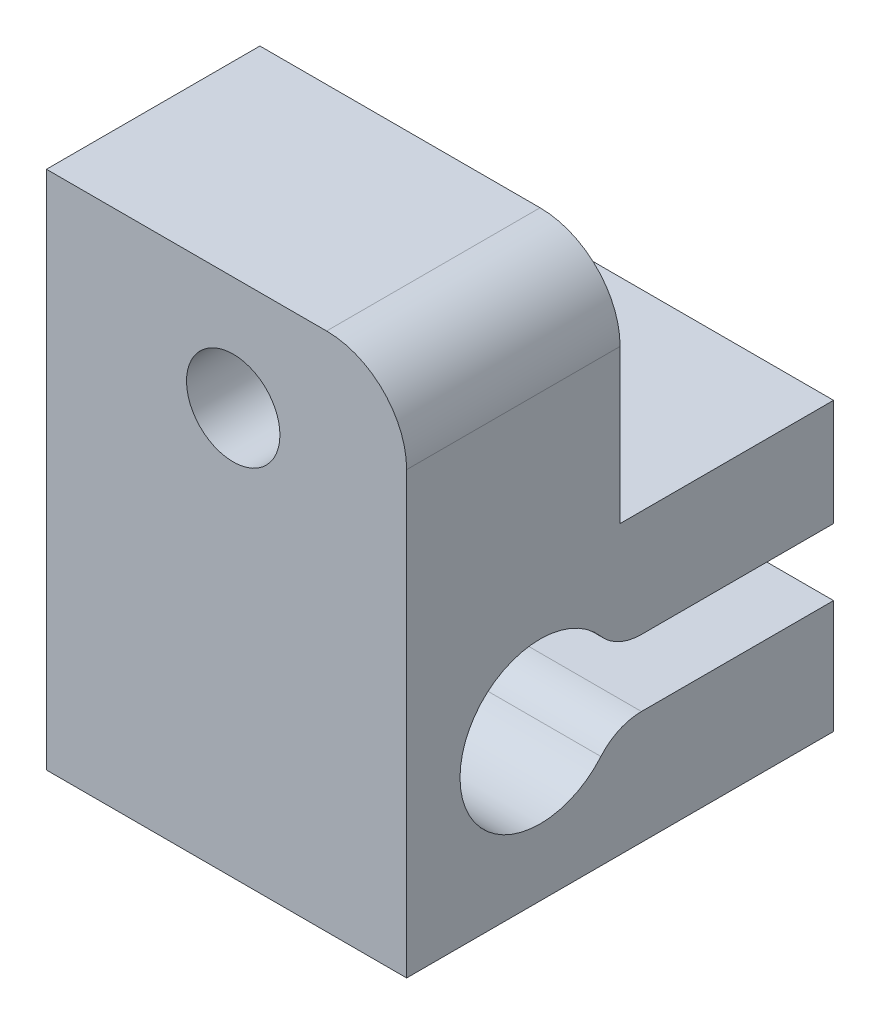
ISO-10303-21;
HEADER;
FILE_DESCRIPTION(('STEP AP214'),'2;1');
FILE_NAME('part.step','',(''),(''),'','','');
FILE_SCHEMA(('AUTOMOTIVE_DESIGN { 1 0 10303 214 1 1 1 1 }'));
ENDSEC;
DATA;
#1=APPLICATION_CONTEXT('core data for automotive mechanical design processes');
#2=APPLICATION_PROTOCOL_DEFINITION('international standard','automotive_design',2000,#1);
#3=PRODUCT_CONTEXT('',#1,'mechanical');
#4=PRODUCT('Part','Part','',(#3));
#5=PRODUCT_RELATED_PRODUCT_CATEGORY('part','',(#4));
#6=PRODUCT_DEFINITION_FORMATION('','',#4);
#7=PRODUCT_DEFINITION_CONTEXT('part definition',#1,'design');
#8=PRODUCT_DEFINITION('design','',#6,#7);
#9=PRODUCT_DEFINITION_SHAPE('','',#8);
#10=(LENGTH_UNIT() NAMED_UNIT(*) SI_UNIT(.MILLI.,.METRE.));
#11=(NAMED_UNIT(*) PLANE_ANGLE_UNIT() SI_UNIT($,.RADIAN.));
#12=(NAMED_UNIT(*) SI_UNIT($,.STERADIAN.) SOLID_ANGLE_UNIT());
#13=UNCERTAINTY_MEASURE_WITH_UNIT(LENGTH_MEASURE(1.E-05),#10,'distance_accuracy_value','');
#14=(GEOMETRIC_REPRESENTATION_CONTEXT(3) GLOBAL_UNCERTAINTY_ASSIGNED_CONTEXT((#13)) GLOBAL_UNIT_ASSIGNED_CONTEXT((#10,
#11,#12)) REPRESENTATION_CONTEXT('',''));
#15=CARTESIAN_POINT('',(0.,0.,0.));
#16=DIRECTION('',(0.,0.,1.));
#17=DIRECTION('',(1.,0.,0.));
#18=AXIS2_PLACEMENT_3D('',#15,#16,#17);
#19=CARTESIAN_POINT('',(7.,5.5,8.));
#20=DIRECTION('',(0.,0.,-1.));
#21=DIRECTION('',(0.,1.,0.));
#22=AXIS2_PLACEMENT_3D('',#19,#20,#21);
#23=CYLINDRICAL_SURFACE('',#22,1.75);
#24=CARTESIAN_POINT('',(7.,5.5,8.));
#25=DIRECTION('',(0.,0.,-1.));
#26=DIRECTION('',(0.,1.,0.));
#27=AXIS2_PLACEMENT_3D('',#24,#25,#26);
#28=CIRCLE('',#27,1.75);
#29=CARTESIAN_POINT('',(7.,7.25,8.));
#30=VERTEX_POINT('',#29);
#31=EDGE_CURVE('E653',#30,#30,#28,.T.);
#32=ORIENTED_EDGE('',*,*,#31,.F.);
#33=EDGE_LOOP('',(#32));
#34=FACE_BOUND('',#33,.T.);
#35=CARTESIAN_POINT('',(7.,5.5,5.));
#36=DIRECTION('',(0.,0.,-1.));
#37=DIRECTION('',(0.,1.,0.));
#38=AXIS2_PLACEMENT_3D('',#35,#36,#37);
#39=CIRCLE('',#38,1.75);
#40=CARTESIAN_POINT('',(7.,7.25,5.));
#41=VERTEX_POINT('',#40);
#42=EDGE_CURVE('E648',#41,#41,#39,.T.);
#43=ORIENTED_EDGE('',*,*,#42,.T.);
#44=EDGE_LOOP('',(#43));
#45=FACE_BOUND('',#44,.T.);
#46=ADVANCED_FACE('F55',(#34,#45),#23,.F.);
#47=CARTESIAN_POINT('',(0.,-4.25,3.));
#48=DIRECTION('',(1.,0.,0.));
#49=DIRECTION('',(0.,0.,-1.));
#50=AXIS2_PLACEMENT_3D('',#47,#48,#49);
#51=CYLINDRICAL_SURFACE('',#50,1.75);
#52=CARTESIAN_POINT('',(4.5,-4.25,3.));
#53=DIRECTION('',(1.,0.,0.));
#54=DIRECTION('',(0.,0.,-1.));
#55=AXIS2_PLACEMENT_3D('',#52,#53,#54);
#56=CIRCLE('',#55,1.75);
#57=CARTESIAN_POINT('',(4.5,-4.25,1.25));
#58=VERTEX_POINT('',#57);
#59=EDGE_CURVE('E255',#58,#58,#56,.T.);
#60=ORIENTED_EDGE('',*,*,#59,.T.);
#61=EDGE_LOOP('',(#60));
#62=FACE_BOUND('',#61,.T.);
#63=CARTESIAN_POINT('',(2.5,-4.25,3.));
#64=DIRECTION('',(-1.,0.,0.));
#65=DIRECTION('',(0.,0.,1.));
#66=AXIS2_PLACEMENT_3D('',#63,#64,#65);
#67=CIRCLE('',#66,1.75);
#68=CARTESIAN_POINT('',(2.5,-4.25,4.75));
#69=VERTEX_POINT('',#68);
#70=EDGE_CURVE('E222',#69,#69,#67,.T.);
#71=ORIENTED_EDGE('',*,*,#70,.T.);
#72=EDGE_LOOP('',(#71));
#73=FACE_BOUND('',#72,.T.);
#74=ADVANCED_FACE('F468',(#62,#73),#51,.F.);
#75=CARTESIAN_POINT('',(13.5,0.,0.));
#76=DIRECTION('',(0.,0.,-1.));
#77=DIRECTION('',(0.,1.,0.));
#78=AXIS2_PLACEMENT_3D('',#75,#76,#77);
#79=PLANE('',#78);
#80=CARTESIAN_POINT('',(7.,5.5,0.));
#81=DIRECTION('',(0.,0.,-1.));
#82=DIRECTION('',(0.,1.,0.));
#83=AXIS2_PLACEMENT_3D('',#80,#81,#82);
#84=CIRCLE('',#83,3.);
#85=CARTESIAN_POINT('',(7.,8.5,0.));
#86=VERTEX_POINT('',#85);
#87=EDGE_CURVE('E644',#86,#86,#84,.T.);
#88=ORIENTED_EDGE('',*,*,#87,.F.);
#89=EDGE_LOOP('',(#88));
#90=FACE_BOUND('',#89,.T.);
#91=DIRECTION('',(-1.,0.,0.));
#92=VECTOR('',#91,1.);
#93=CARTESIAN_POINT('',(13.5,9.75,0.));
#94=LINE('',#93,#92);
#95=CARTESIAN_POINT('',(10.5,9.75,0.));
#96=VERTEX_POINT('',#95);
#97=CARTESIAN_POINT('',(0.,9.75,0.));
#98=VERTEX_POINT('',#97);
#99=EDGE_CURVE('E357',#96,#98,#94,.T.);
#100=ORIENTED_EDGE('',*,*,#99,.F.);
#101=CARTESIAN_POINT('',(10.5,6.75,0.));
#102=DIRECTION('',(0.,0.,-1.));
#103=DIRECTION('',(0.,1.,0.));
#104=AXIS2_PLACEMENT_3D('',#101,#102,#103);
#105=CIRCLE('',#104,3.);
#106=CARTESIAN_POINT('',(13.5,6.75,0.));
#107=VERTEX_POINT('',#106);
#108=EDGE_CURVE('E367',#96,#107,#105,.T.);
#109=ORIENTED_EDGE('',*,*,#108,.T.);
#110=DIRECTION('',(0.,-1.,0.));
#111=VECTOR('',#110,1.);
#112=CARTESIAN_POINT('',(13.5,0.,0.));
#113=LINE('',#112,#111);
#114=CARTESIAN_POINT('',(13.5,0.999999999999998,0.));
#115=VERTEX_POINT('',#114);
#116=EDGE_CURVE('E300',#107,#115,#113,.T.);
#117=ORIENTED_EDGE('',*,*,#116,.T.);
#118=DIRECTION('',(-1.,0.,0.));
#119=VECTOR('',#118,1.);
#120=CARTESIAN_POINT('',(13.5,0.999999999999998,0.));
#121=LINE('',#120,#119);
#122=CARTESIAN_POINT('',(0.,0.999999999999998,0.));
#123=VERTEX_POINT('',#122);
#124=EDGE_CURVE('E320',#115,#123,#121,.T.);
#125=ORIENTED_EDGE('',*,*,#124,.T.);
#126=DIRECTION('',(0.,-1.,0.));
#127=VECTOR('',#126,1.);
#128=CARTESIAN_POINT('',(0.,0.,0.));
#129=LINE('',#128,#127);
#130=EDGE_CURVE('E271',#98,#123,#129,.T.);
#131=ORIENTED_EDGE('',*,*,#130,.F.);
#132=EDGE_LOOP('',(#100,#109,#117,#125,#131));
#133=FACE_BOUND('',#132,.T.);
#134=ADVANCED_FACE('F430',(#90,#133),#79,.T.);
#135=CARTESIAN_POINT('',(13.5,9.75,0.));
#136=DIRECTION('',(0.,1.,0.));
#137=DIRECTION('',(0.,0.,1.));
#138=AXIS2_PLACEMENT_3D('',#135,#136,#137);
#139=PLANE('',#138);
#140=DIRECTION('',(-1.,0.,0.));
#141=VECTOR('',#140,1.);
#142=CARTESIAN_POINT('',(13.5,9.75,8.));
#143=LINE('',#142,#141);
#144=CARTESIAN_POINT('',(10.5,9.75,8.));
#145=VERTEX_POINT('',#144);
#146=CARTESIAN_POINT('',(0.,9.75,8.));
#147=VERTEX_POINT('',#146);
#148=EDGE_CURVE('E354',#145,#147,#143,.T.);
#149=ORIENTED_EDGE('',*,*,#148,.F.);
#150=DIRECTION('',(0.,0.,-1.));
#151=VECTOR('',#150,1.);
#152=CARTESIAN_POINT('',(10.5,9.75,0.));
#153=LINE('',#152,#151);
#154=EDGE_CURVE('E360',#145,#96,#153,.T.);
#155=ORIENTED_EDGE('',*,*,#154,.T.);
#156=ORIENTED_EDGE('',*,*,#99,.T.);
#157=DIRECTION('',(0.,0.,-1.));
#158=VECTOR('',#157,1.);
#159=CARTESIAN_POINT('',(0.,9.75,0.));
#160=LINE('',#159,#158);
#161=EDGE_CURVE('E324',#147,#98,#160,.T.);
#162=ORIENTED_EDGE('',*,*,#161,.F.);
#163=EDGE_LOOP('',(#149,#155,#156,#162));
#164=FACE_BOUND('',#163,.T.);
#165=ADVANCED_FACE('F437',(#164),#139,.T.);
#166=CARTESIAN_POINT('',(13.5,0.,8.));
#167=DIRECTION('',(0.,0.,1.));
#168=DIRECTION('',(1.,0.,0.));
#169=AXIS2_PLACEMENT_3D('',#166,#167,#168);
#170=PLANE('',#169);
#171=ORIENTED_EDGE('',*,*,#31,.T.);
#172=EDGE_LOOP('',(#171));
#173=FACE_BOUND('',#172,.T.);
#174=DIRECTION('',(0.,1.,0.));
#175=VECTOR('',#174,1.);
#176=CARTESIAN_POINT('',(13.5,0.,8.));
#177=LINE('',#176,#175);
#178=CARTESIAN_POINT('',(13.5,-9.75,8.));
#179=VERTEX_POINT('',#178);
#180=CARTESIAN_POINT('',(13.5,6.75,8.));
#181=VERTEX_POINT('',#180);
#182=EDGE_CURVE('E303',#179,#181,#177,.T.);
#183=ORIENTED_EDGE('',*,*,#182,.T.);
#184=CARTESIAN_POINT('',(10.5,6.75,8.));
#185=DIRECTION('',(0.,0.,1.));
#186=DIRECTION('',(1.,0.,0.));
#187=AXIS2_PLACEMENT_3D('',#184,#185,#186);
#188=CIRCLE('',#187,3.);
#189=EDGE_CURVE('E373',#181,#145,#188,.T.);
#190=ORIENTED_EDGE('',*,*,#189,.T.);
#191=ORIENTED_EDGE('',*,*,#148,.T.);
#192=DIRECTION('',(0.,1.,0.));
#193=VECTOR('',#192,1.);
#194=CARTESIAN_POINT('',(0.,0.,8.));
#195=LINE('',#194,#193);
#196=CARTESIAN_POINT('',(0.,-9.75,8.));
#197=VERTEX_POINT('',#196);
#198=EDGE_CURVE('E328',#197,#147,#195,.T.);
#199=ORIENTED_EDGE('',*,*,#198,.F.);
#200=DIRECTION('',(-1.,0.,0.));
#201=VECTOR('',#200,1.);
#202=CARTESIAN_POINT('',(13.5,-9.75,8.));
#203=LINE('',#202,#201);
#204=EDGE_CURVE('E351',#179,#197,#203,.T.);
#205=ORIENTED_EDGE('',*,*,#204,.F.);
#206=EDGE_LOOP('',(#183,#190,#191,#199,#205));
#207=FACE_BOUND('',#206,.T.);
#208=ADVANCED_FACE('F441',(#173,#207),#170,.T.);
#209=CARTESIAN_POINT('',(13.5,-9.75,0.));
#210=DIRECTION('',(0.,1.,0.));
#211=DIRECTION('',(0.,0.,1.));
#212=AXIS2_PLACEMENT_3D('',#209,#210,#211);
#213=PLANE('',#212);
#214=DIRECTION('',(0.,0.,-1.));
#215=VECTOR('',#214,1.);
#216=CARTESIAN_POINT('',(0.,-9.75,0.));
#217=LINE('',#216,#215);
#218=CARTESIAN_POINT('',(0.,-9.75,-8.));
#219=VERTEX_POINT('',#218);
#220=EDGE_CURVE('E332',#197,#219,#217,.T.);
#221=ORIENTED_EDGE('',*,*,#220,.T.);
#222=DIRECTION('',(-1.,0.,0.));
#223=VECTOR('',#222,1.);
#224=CARTESIAN_POINT('',(13.5,-9.75,-8.));
#225=LINE('',#224,#223);
#226=CARTESIAN_POINT('',(13.5,-9.75,-8.));
#227=VERTEX_POINT('',#226);
#228=EDGE_CURVE('E347',#227,#219,#225,.T.);
#229=ORIENTED_EDGE('',*,*,#228,.F.);
#230=DIRECTION('',(0.,0.,-1.));
#231=VECTOR('',#230,1.);
#232=CARTESIAN_POINT('',(13.5,-9.75,0.));
#233=LINE('',#232,#231);
#234=EDGE_CURVE('E308',#179,#227,#233,.T.);
#235=ORIENTED_EDGE('',*,*,#234,.F.);
#236=ORIENTED_EDGE('',*,*,#204,.T.);
#237=EDGE_LOOP('',(#221,#229,#235,#236));
#238=FACE_BOUND('',#237,.T.);
#239=ADVANCED_FACE('F447',(#238),#213,.F.);
#240=CARTESIAN_POINT('',(13.5,0.,-8.));
#241=DIRECTION('',(0.,0.,1.));
#242=DIRECTION('',(1.,0.,0.));
#243=AXIS2_PLACEMENT_3D('',#240,#241,#242);
#244=PLANE('',#243);
#245=DIRECTION('',(0.,-1.,0.));
#246=VECTOR('',#245,1.);
#247=CARTESIAN_POINT('',(4.5,-3.,-8.));
#248=LINE('',#247,#246);
#249=CARTESIAN_POINT('',(4.5,-3.,-8.));
#250=VERTEX_POINT('',#249);
#251=CARTESIAN_POINT('',(4.5,-5.5,-8.));
#252=VERTEX_POINT('',#251);
#253=EDGE_CURVE('E280',#250,#252,#248,.T.);
#254=ORIENTED_EDGE('',*,*,#253,.T.);
#255=DIRECTION('',(1.,0.,0.));
#256=VECTOR('',#255,1.);
#257=CARTESIAN_POINT('',(4.5,-5.5,-8.));
#258=LINE('',#257,#256);
#259=CARTESIAN_POINT('',(13.5,-5.5,-8.));
#260=VERTEX_POINT('',#259);
#261=EDGE_CURVE('E288',#252,#260,#258,.T.);
#262=ORIENTED_EDGE('',*,*,#261,.T.);
#263=DIRECTION('',(0.,1.,0.));
#264=VECTOR('',#263,1.);
#265=CARTESIAN_POINT('',(13.5,0.,-8.));
#266=LINE('',#265,#264);
#267=EDGE_CURVE('E312',#227,#260,#266,.T.);
#268=ORIENTED_EDGE('',*,*,#267,.F.);
#269=ORIENTED_EDGE('',*,*,#228,.T.);
#270=DIRECTION('',(0.,1.,0.));
#271=VECTOR('',#270,1.);
#272=CARTESIAN_POINT('',(0.,0.,-8.));
#273=LINE('',#272,#271);
#274=CARTESIAN_POINT('',(0.,0.999999999999999,-8.));
#275=VERTEX_POINT('',#274);
#276=EDGE_CURVE('E335',#219,#275,#273,.T.);
#277=ORIENTED_EDGE('',*,*,#276,.T.);
#278=DIRECTION('',(-1.,0.,0.));
#279=VECTOR('',#278,1.);
#280=CARTESIAN_POINT('',(13.5,0.999999999999999,-8.));
#281=LINE('',#280,#279);
#282=CARTESIAN_POINT('',(13.5,0.999999999999999,-8.));
#283=VERTEX_POINT('',#282);
#284=EDGE_CURVE('E343',#283,#275,#281,.T.);
#285=ORIENTED_EDGE('',*,*,#284,.F.);
#286=CARTESIAN_POINT('',(13.5,-3.,-8.));
#287=VERTEX_POINT('',#286);
#288=EDGE_CURVE('E311',#287,#283,#266,.T.);
#289=ORIENTED_EDGE('',*,*,#288,.F.);
#290=DIRECTION('',(1.,0.,0.));
#291=VECTOR('',#290,1.);
#292=CARTESIAN_POINT('',(4.5,-3.,-8.));
#293=LINE('',#292,#291);
#294=EDGE_CURVE('E276',#250,#287,#293,.T.);
#295=ORIENTED_EDGE('',*,*,#294,.F.);
#296=EDGE_LOOP('',(#254,#262,#268,#269,#277,#285,#289,#295));
#297=FACE_BOUND('',#296,.T.);
#298=ADVANCED_FACE('F417',(#297),#244,.F.);
#299=CARTESIAN_POINT('',(13.5,0.999999999999998,0.));
#300=DIRECTION('',(0.,-1.,0.));
#301=DIRECTION('',(0.,0.,-1.));
#302=AXIS2_PLACEMENT_3D('',#299,#300,#301);
#303=PLANE('',#302);
#304=DIRECTION('',(0.,0.,1.));
#305=VECTOR('',#304,1.);
#306=CARTESIAN_POINT('',(0.,0.999999999999998,0.));
#307=LINE('',#306,#305);
#308=EDGE_CURVE('E304',#275,#123,#307,.T.);
#309=ORIENTED_EDGE('',*,*,#308,.T.);
#310=ORIENTED_EDGE('',*,*,#124,.F.);
#311=DIRECTION('',(0.,0.,1.));
#312=VECTOR('',#311,1.);
#313=CARTESIAN_POINT('',(13.5,0.999999999999998,0.));
#314=LINE('',#313,#312);
#315=EDGE_CURVE('E316',#283,#115,#314,.T.);
#316=ORIENTED_EDGE('',*,*,#315,.F.);
#317=ORIENTED_EDGE('',*,*,#284,.T.);
#318=EDGE_LOOP('',(#309,#310,#316,#317));
#319=FACE_BOUND('',#318,.T.);
#320=ADVANCED_FACE('F425',(#319),#303,.F.);
#321=CARTESIAN_POINT('',(13.5,0.,0.));
#322=DIRECTION('',(1.,0.,0.));
#323=DIRECTION('',(0.,0.,-1.));
#324=AXIS2_PLACEMENT_3D('',#321,#322,#323);
#325=PLANE('',#324);
#326=DIRECTION('',(0.,0.,-1.));
#327=VECTOR('',#326,1.);
#328=CARTESIAN_POINT('',(13.5,-5.5,3.));
#329=LINE('',#328,#327);
#330=CARTESIAN_POINT('',(13.5,-5.5,-0.799671038392669));
#331=VERTEX_POINT('',#330);
#332=EDGE_CURVE('E289',#331,#260,#329,.T.);
#333=ORIENTED_EDGE('',*,*,#332,.F.);
#334=CARTESIAN_POINT('',(13.5,-7.5,-0.799671038392669));
#335=DIRECTION('',(1.,0.,0.));
#336=DIRECTION('',(0.,0.,-1.));
#337=AXIS2_PLACEMENT_3D('',#334,#335,#336);
#338=CIRCLE('',#337,2.);
#339=CARTESIAN_POINT('',(13.5,-6.2,0.720197376964399));
#340=VERTEX_POINT('',#339);
#341=EDGE_CURVE('E388',#331,#340,#338,.T.);
#342=ORIENTED_EDGE('',*,*,#341,.T.);
#343=CARTESIAN_POINT('',(13.5,-4.25,3.));
#344=DIRECTION('',(1.,0.,0.));
#345=DIRECTION('',(0.,0.,-1.));
#346=AXIS2_PLACEMENT_3D('',#343,#344,#345);
#347=CIRCLE('',#346,3.);
#348=CARTESIAN_POINT('',(13.5,-2.3,0.720197376964399));
#349=VERTEX_POINT('',#348);
#350=EDGE_CURVE('E272',#349,#340,#347,.T.);
#351=ORIENTED_EDGE('',*,*,#350,.F.);
#352=CARTESIAN_POINT('',(13.5,-1.,-0.799671038392668));
#353=DIRECTION('',(1.,0.,0.));
#354=DIRECTION('',(0.,0.,-1.));
#355=AXIS2_PLACEMENT_3D('',#352,#353,#354);
#356=CIRCLE('',#355,2.);
#357=CARTESIAN_POINT('',(13.5,-3.,-0.799671038392668));
#358=VERTEX_POINT('',#357);
#359=EDGE_CURVE('E77',#349,#358,#356,.T.);
#360=ORIENTED_EDGE('',*,*,#359,.T.);
#361=DIRECTION('',(0.,0.,-1.));
#362=VECTOR('',#361,1.);
#363=CARTESIAN_POINT('',(13.5,-3.,3.));
#364=LINE('',#363,#362);
#365=EDGE_CURVE('E281',#358,#287,#364,.T.);
#366=ORIENTED_EDGE('',*,*,#365,.T.);
#367=ORIENTED_EDGE('',*,*,#288,.T.);
#368=ORIENTED_EDGE('',*,*,#315,.T.);
#369=ORIENTED_EDGE('',*,*,#116,.F.);
#370=DIRECTION('',(0.,0.,-1.));
#371=VECTOR('',#370,1.);
#372=CARTESIAN_POINT('',(13.5,6.75,0.));
#373=LINE('',#372,#371);
#374=EDGE_CURVE('E370',#107,#181,#373,.F.);
#375=ORIENTED_EDGE('',*,*,#374,.T.);
#376=ORIENTED_EDGE('',*,*,#182,.F.);
#377=ORIENTED_EDGE('',*,*,#234,.T.);
#378=ORIENTED_EDGE('',*,*,#267,.T.);
#379=EDGE_LOOP('',(#333,#342,#351,#360,#366,#367,#368,#369,#375,#376,#377,#378));
#380=FACE_BOUND('',#379,.T.);
#381=ADVANCED_FACE('F409',(#380),#325,.T.);
#382=CARTESIAN_POINT('',(0.,0.,0.));
#383=DIRECTION('',(1.,0.,0.));
#384=DIRECTION('',(0.,0.,-1.));
#385=AXIS2_PLACEMENT_3D('',#382,#383,#384);
#386=PLANE('',#385);
#387=DIRECTION('',(0.,0.866025403784439,-0.5));
#388=VECTOR('',#387,1.);
#389=CARTESIAN_POINT('',(0.,-4.25,6.17542648054294));
#390=LINE('',#389,#388);
#391=CARTESIAN_POINT('',(0.,-4.25,6.17542648054294));
#392=VERTEX_POINT('',#391);
#393=CARTESIAN_POINT('',(0.,-1.5,4.58771324027147));
#394=VERTEX_POINT('',#393);
#395=EDGE_CURVE('E238',#392,#394,#390,.T.);
#396=ORIENTED_EDGE('',*,*,#395,.F.);
#397=DIRECTION('',(0.,0.866025403784438,0.5));
#398=VECTOR('',#397,1.);
#399=CARTESIAN_POINT('',(0.,-7.,4.58771324027147));
#400=LINE('',#399,#398);
#401=CARTESIAN_POINT('',(0.,-7.,4.58771324027147));
#402=VERTEX_POINT('',#401);
#403=EDGE_CURVE('E194',#402,#392,#400,.T.);
#404=ORIENTED_EDGE('',*,*,#403,.F.);
#405=DIRECTION('',(0.,0.,1.));
#406=VECTOR('',#405,1.);
#407=CARTESIAN_POINT('',(0.,-7.,1.41228675972853));
#408=LINE('',#407,#406);
#409=CARTESIAN_POINT('',(0.,-7.,1.41228675972853));
#410=VERTEX_POINT('',#409);
#411=EDGE_CURVE('E215',#410,#402,#408,.T.);
#412=ORIENTED_EDGE('',*,*,#411,.F.);
#413=DIRECTION('',(0.,-0.866025403784439,0.5));
#414=VECTOR('',#413,1.);
#415=CARTESIAN_POINT('',(0.,-4.25,-0.175426480542943));
#416=LINE('',#415,#414);
#417=CARTESIAN_POINT('',(0.,-4.25,-0.175426480542943));
#418=VERTEX_POINT('',#417);
#419=EDGE_CURVE('E219',#418,#410,#416,.T.);
#420=ORIENTED_EDGE('',*,*,#419,.F.);
#421=DIRECTION('',(0.,-0.866025403784438,-0.5));
#422=VECTOR('',#421,1.);
#423=CARTESIAN_POINT('',(0.,-1.5,1.41228675972853));
#424=LINE('',#423,#422);
#425=CARTESIAN_POINT('',(0.,-1.5,1.41228675972853));
#426=VERTEX_POINT('',#425);
#427=EDGE_CURVE('E245',#426,#418,#424,.T.);
#428=ORIENTED_EDGE('',*,*,#427,.F.);
#429=DIRECTION('',(0.,0.,-1.));
#430=VECTOR('',#429,1.);
#431=CARTESIAN_POINT('',(0.,-1.5,4.58771324027147));
#432=LINE('',#431,#430);
#433=EDGE_CURVE('E241',#394,#426,#432,.T.);
#434=ORIENTED_EDGE('',*,*,#433,.F.);
#435=EDGE_LOOP('',(#396,#404,#412,#420,#428,#434));
#436=FACE_BOUND('',#435,.T.);
#437=ORIENTED_EDGE('',*,*,#130,.T.);
#438=ORIENTED_EDGE('',*,*,#308,.F.);
#439=ORIENTED_EDGE('',*,*,#276,.F.);
#440=ORIENTED_EDGE('',*,*,#220,.F.);
#441=ORIENTED_EDGE('',*,*,#198,.T.);
#442=ORIENTED_EDGE('',*,*,#161,.T.);
#443=EDGE_LOOP('',(#437,#438,#439,#440,#441,#442));
#444=FACE_BOUND('',#443,.T.);
#445=ADVANCED_FACE('F451',(#436,#444),#386,.F.);
#446=CARTESIAN_POINT('',(4.5,0.,0.));
#447=DIRECTION('',(1.,0.,0.));
#448=DIRECTION('',(0.,0.,-1.));
#449=AXIS2_PLACEMENT_3D('',#446,#447,#448);
#450=PLANE('',#449);
#451=ORIENTED_EDGE('',*,*,#59,.F.);
#452=EDGE_LOOP('',(#451));
#453=FACE_BOUND('',#452,.T.);
#454=DIRECTION('',(0.,0.,-1.));
#455=VECTOR('',#454,1.);
#456=CARTESIAN_POINT('',(4.5,-3.,3.));
#457=LINE('',#456,#455);
#458=CARTESIAN_POINT('',(4.5,-3.,-0.799671038392668));
#459=VERTEX_POINT('',#458);
#460=EDGE_CURVE('E285',#459,#250,#457,.T.);
#461=ORIENTED_EDGE('',*,*,#460,.F.);
#462=CARTESIAN_POINT('',(4.5,-1.,-0.799671038392668));
#463=DIRECTION('',(1.,0.,0.));
#464=DIRECTION('',(0.,0.,-1.));
#465=AXIS2_PLACEMENT_3D('',#462,#463,#464);
#466=CIRCLE('',#465,2.);
#467=CARTESIAN_POINT('',(4.5,-2.3,0.720197376964399));
#468=VERTEX_POINT('',#467);
#469=EDGE_CURVE('E12',#459,#468,#466,.F.);
#470=ORIENTED_EDGE('',*,*,#469,.T.);
#471=CARTESIAN_POINT('',(4.5,-4.25,3.));
#472=DIRECTION('',(1.,0.,0.));
#473=DIRECTION('',(0.,0.,-1.));
#474=AXIS2_PLACEMENT_3D('',#471,#472,#473);
#475=CIRCLE('',#474,3.);
#476=CARTESIAN_POINT('',(4.5,-6.2,0.720197376964399));
#477=VERTEX_POINT('',#476);
#478=EDGE_CURVE('E267',#468,#477,#475,.T.);
#479=ORIENTED_EDGE('',*,*,#478,.T.);
#480=CARTESIAN_POINT('',(4.5,-7.5,-0.799671038392669));
#481=DIRECTION('',(1.,0.,0.));
#482=DIRECTION('',(0.,0.,-1.));
#483=AXIS2_PLACEMENT_3D('',#480,#481,#482);
#484=CIRCLE('',#483,2.);
#485=CARTESIAN_POINT('',(4.5,-5.5,-0.799671038392669));
#486=VERTEX_POINT('',#485);
#487=EDGE_CURVE('E64',#477,#486,#484,.F.);
#488=ORIENTED_EDGE('',*,*,#487,.T.);
#489=DIRECTION('',(0.,0.,-1.));
#490=VECTOR('',#489,1.);
#491=CARTESIAN_POINT('',(4.5,-5.5,3.));
#492=LINE('',#491,#490);
#493=EDGE_CURVE('E277',#486,#252,#492,.T.);
#494=ORIENTED_EDGE('',*,*,#493,.T.);
#495=ORIENTED_EDGE('',*,*,#253,.F.);
#496=EDGE_LOOP('',(#461,#470,#479,#488,#494,#495));
#497=FACE_BOUND('',#496,.T.);
#498=ADVANCED_FACE('F397',(#453,#497),#450,.T.);
#499=CARTESIAN_POINT('',(4.5,-4.25,3.));
#500=DIRECTION('',(1.,0.,0.));
#501=DIRECTION('',(0.,0.,-1.));
#502=AXIS2_PLACEMENT_3D('',#499,#500,#501);
#503=CYLINDRICAL_SURFACE('',#502,3.);
#504=ORIENTED_EDGE('',*,*,#350,.T.);
#505=DIRECTION('',(1.,0.,0.));
#506=VECTOR('',#505,1.);
#507=CARTESIAN_POINT('',(4.5,-6.2,0.720197376964398));
#508=LINE('',#507,#506);
#509=EDGE_CURVE('E379',#340,#477,#508,.F.);
#510=ORIENTED_EDGE('',*,*,#509,.T.);
#511=ORIENTED_EDGE('',*,*,#478,.F.);
#512=DIRECTION('',(1.,0.,0.));
#513=VECTOR('',#512,1.);
#514=CARTESIAN_POINT('',(4.5,-2.3,0.720197376964399));
#515=LINE('',#514,#513);
#516=EDGE_CURVE('E376',#468,#349,#515,.T.);
#517=ORIENTED_EDGE('',*,*,#516,.T.);
#518=EDGE_LOOP('',(#504,#510,#511,#517));
#519=FACE_BOUND('',#518,.T.);
#520=ADVANCED_FACE('F411',(#519),#503,.F.);
#521=CARTESIAN_POINT('',(4.5,-5.5,3.));
#522=DIRECTION('',(0.,-1.,0.));
#523=DIRECTION('',(0.,0.,-1.));
#524=AXIS2_PLACEMENT_3D('',#521,#522,#523);
#525=PLANE('',#524);
#526=ORIENTED_EDGE('',*,*,#493,.F.);
#527=DIRECTION('',(1.,0.,0.));
#528=VECTOR('',#527,1.);
#529=CARTESIAN_POINT('',(4.5,-5.5,-0.799671038392669));
#530=LINE('',#529,#528);
#531=EDGE_CURVE('E383',#486,#331,#530,.T.);
#532=ORIENTED_EDGE('',*,*,#531,.T.);
#533=ORIENTED_EDGE('',*,*,#332,.T.);
#534=ORIENTED_EDGE('',*,*,#261,.F.);
#535=EDGE_LOOP('',(#526,#532,#533,#534));
#536=FACE_BOUND('',#535,.T.);
#537=ADVANCED_FACE('F405',(#536),#525,.F.);
#538=CARTESIAN_POINT('',(4.5,-3.,3.));
#539=DIRECTION('',(0.,-1.,0.));
#540=DIRECTION('',(0.,0.,-1.));
#541=AXIS2_PLACEMENT_3D('',#538,#539,#540);
#542=PLANE('',#541);
#543=ORIENTED_EDGE('',*,*,#365,.F.);
#544=DIRECTION('',(-1.,0.,0.));
#545=VECTOR('',#544,1.);
#546=CARTESIAN_POINT('',(4.5,-3.,-0.799671038392668));
#547=LINE('',#546,#545);
#548=EDGE_CURVE('E391',#358,#459,#547,.T.);
#549=ORIENTED_EDGE('',*,*,#548,.T.);
#550=ORIENTED_EDGE('',*,*,#460,.T.);
#551=ORIENTED_EDGE('',*,*,#294,.T.);
#552=EDGE_LOOP('',(#543,#549,#550,#551));
#553=FACE_BOUND('',#552,.T.);
#554=ADVANCED_FACE('F413',(#553),#542,.T.);
#555=CARTESIAN_POINT('',(2.5,-7.,4.58771324027147));
#556=DIRECTION('',(0.,-0.5,0.866025403784438));
#557=DIRECTION('',(0.,-0.866025403784439,-0.5));
#558=AXIS2_PLACEMENT_3D('',#555,#556,#557);
#559=PLANE('',#558);
#560=ORIENTED_EDGE('',*,*,#403,.T.);
#561=DIRECTION('',(-1.,0.,0.));
#562=VECTOR('',#561,1.);
#563=CARTESIAN_POINT('',(2.5,-4.25,6.17542648054294));
#564=LINE('',#563,#562);
#565=CARTESIAN_POINT('',(2.5,-4.25,6.17542648054294));
#566=VERTEX_POINT('',#565);
#567=EDGE_CURVE('E187',#566,#392,#564,.T.);
#568=ORIENTED_EDGE('',*,*,#567,.F.);
#569=DIRECTION('',(0.,0.866025403784438,0.5));
#570=VECTOR('',#569,1.);
#571=CARTESIAN_POINT('',(2.5,-7.,4.58771324027147));
#572=LINE('',#571,#570);
#573=CARTESIAN_POINT('',(2.5,-7.,4.58771324027147));
#574=VERTEX_POINT('',#573);
#575=EDGE_CURVE('E191',#574,#566,#572,.T.);
#576=ORIENTED_EDGE('',*,*,#575,.F.);
#577=DIRECTION('',(-1.,0.,0.));
#578=VECTOR('',#577,1.);
#579=CARTESIAN_POINT('',(2.5,-7.,4.58771324027147));
#580=LINE('',#579,#578);
#581=EDGE_CURVE('E252',#574,#402,#580,.T.);
#582=ORIENTED_EDGE('',*,*,#581,.T.);
#583=EDGE_LOOP('',(#560,#568,#576,#582));
#584=FACE_BOUND('',#583,.T.);
#585=ADVANCED_FACE('F189',(#584),#559,.F.);
#586=CARTESIAN_POINT('',(2.5,-7.,1.41228675972853));
#587=DIRECTION('',(0.,-1.,0.));
#588=DIRECTION('',(0.,0.,-1.));
#589=AXIS2_PLACEMENT_3D('',#586,#587,#588);
#590=PLANE('',#589);
#591=ORIENTED_EDGE('',*,*,#411,.T.);
#592=ORIENTED_EDGE('',*,*,#581,.F.);
#593=DIRECTION('',(0.,0.,1.));
#594=VECTOR('',#593,1.);
#595=CARTESIAN_POINT('',(2.5,-7.,1.41228675972853));
#596=LINE('',#595,#594);
#597=CARTESIAN_POINT('',(2.5,-7.,1.41228675972853));
#598=VERTEX_POINT('',#597);
#599=EDGE_CURVE('E200',#598,#574,#596,.T.);
#600=ORIENTED_EDGE('',*,*,#599,.F.);
#601=DIRECTION('',(-1.,0.,0.));
#602=VECTOR('',#601,1.);
#603=CARTESIAN_POINT('',(2.5,-7.,1.41228675972853));
#604=LINE('',#603,#602);
#605=EDGE_CURVE('E256',#598,#410,#604,.T.);
#606=ORIENTED_EDGE('',*,*,#605,.T.);
#607=EDGE_LOOP('',(#591,#592,#600,#606));
#608=FACE_BOUND('',#607,.T.);
#609=ADVANCED_FACE('F485',(#608),#590,.F.);
#610=CARTESIAN_POINT('',(2.5,-4.25,-0.175426480542943));
#611=DIRECTION('',(0.,-0.5,-0.866025403784438));
#612=DIRECTION('',(0.,0.866025403784439,-0.5));
#613=AXIS2_PLACEMENT_3D('',#610,#611,#612);
#614=PLANE('',#613);
#615=ORIENTED_EDGE('',*,*,#419,.T.);
#616=ORIENTED_EDGE('',*,*,#605,.F.);
#617=DIRECTION('',(0.,-0.866025403784439,0.5));
#618=VECTOR('',#617,1.);
#619=CARTESIAN_POINT('',(2.5,-4.25,-0.175426480542943));
#620=LINE('',#619,#618);
#621=CARTESIAN_POINT('',(2.5,-4.25,-0.175426480542943));
#622=VERTEX_POINT('',#621);
#623=EDGE_CURVE('E231',#622,#598,#620,.T.);
#624=ORIENTED_EDGE('',*,*,#623,.F.);
#625=DIRECTION('',(-1.,0.,0.));
#626=VECTOR('',#625,1.);
#627=CARTESIAN_POINT('',(2.5,-4.25,-0.175426480542943));
#628=LINE('',#627,#626);
#629=EDGE_CURVE('E259',#622,#418,#628,.T.);
#630=ORIENTED_EDGE('',*,*,#629,.T.);
#631=EDGE_LOOP('',(#615,#616,#624,#630));
#632=FACE_BOUND('',#631,.T.);
#633=ADVANCED_FACE('F488',(#632),#614,.F.);
#634=CARTESIAN_POINT('',(2.5,-1.5,1.41228675972853));
#635=DIRECTION('',(0.,0.5,-0.866025403784439));
#636=DIRECTION('',(0.,0.866025403784439,0.5));
#637=AXIS2_PLACEMENT_3D('',#634,#635,#636);
#638=PLANE('',#637);
#639=ORIENTED_EDGE('',*,*,#427,.T.);
#640=ORIENTED_EDGE('',*,*,#629,.F.);
#641=DIRECTION('',(0.,-0.866025403784438,-0.5));
#642=VECTOR('',#641,1.);
#643=CARTESIAN_POINT('',(2.5,-1.5,1.41228675972853));
#644=LINE('',#643,#642);
#645=CARTESIAN_POINT('',(2.5,-1.5,1.41228675972853));
#646=VERTEX_POINT('',#645);
#647=EDGE_CURVE('E227',#646,#622,#644,.T.);
#648=ORIENTED_EDGE('',*,*,#647,.F.);
#649=DIRECTION('',(-1.,0.,0.));
#650=VECTOR('',#649,1.);
#651=CARTESIAN_POINT('',(2.5,-1.5,1.41228675972853));
#652=LINE('',#651,#650);
#653=EDGE_CURVE('E262',#646,#426,#652,.T.);
#654=ORIENTED_EDGE('',*,*,#653,.T.);
#655=EDGE_LOOP('',(#639,#640,#648,#654));
#656=FACE_BOUND('',#655,.T.);
#657=ADVANCED_FACE('F492',(#656),#638,.F.);
#658=CARTESIAN_POINT('',(2.5,-1.5,4.58771324027147));
#659=DIRECTION('',(0.,1.,0.));
#660=DIRECTION('',(0.,0.,1.));
#661=AXIS2_PLACEMENT_3D('',#658,#659,#660);
#662=PLANE('',#661);
#663=ORIENTED_EDGE('',*,*,#433,.T.);
#664=ORIENTED_EDGE('',*,*,#653,.F.);
#665=DIRECTION('',(0.,0.,-1.));
#666=VECTOR('',#665,1.);
#667=CARTESIAN_POINT('',(2.5,-1.5,4.58771324027147));
#668=LINE('',#667,#666);
#669=CARTESIAN_POINT('',(2.5,-1.5,4.58771324027147));
#670=VERTEX_POINT('',#669);
#671=EDGE_CURVE('E209',#670,#646,#668,.T.);
#672=ORIENTED_EDGE('',*,*,#671,.F.);
#673=DIRECTION('',(-1.,0.,0.));
#674=VECTOR('',#673,1.);
#675=CARTESIAN_POINT('',(2.5,-1.5,4.58771324027147));
#676=LINE('',#675,#674);
#677=EDGE_CURVE('E199',#670,#394,#676,.T.);
#678=ORIENTED_EDGE('',*,*,#677,.T.);
#679=EDGE_LOOP('',(#663,#664,#672,#678));
#680=FACE_BOUND('',#679,.T.);
#681=ADVANCED_FACE('F496',(#680),#662,.F.);
#682=CARTESIAN_POINT('',(2.5,-4.25,6.17542648054294));
#683=DIRECTION('',(0.,0.5,0.866025403784438));
#684=DIRECTION('',(0.,-0.866025403784438,0.5));
#685=AXIS2_PLACEMENT_3D('',#682,#683,#684);
#686=PLANE('',#685);
#687=ORIENTED_EDGE('',*,*,#395,.T.);
#688=ORIENTED_EDGE('',*,*,#677,.F.);
#689=DIRECTION('',(0.,0.866025403784439,-0.5));
#690=VECTOR('',#689,1.);
#691=CARTESIAN_POINT('',(2.5,-4.25,6.17542648054294));
#692=LINE('',#691,#690);
#693=EDGE_CURVE('E203',#566,#670,#692,.T.);
#694=ORIENTED_EDGE('',*,*,#693,.F.);
#695=ORIENTED_EDGE('',*,*,#567,.T.);
#696=EDGE_LOOP('',(#687,#688,#694,#695));
#697=FACE_BOUND('',#696,.T.);
#698=ADVANCED_FACE('F204',(#697),#686,.F.);
#699=CARTESIAN_POINT('',(2.5,0.,0.));
#700=DIRECTION('',(-1.,0.,0.));
#701=DIRECTION('',(0.,0.,1.));
#702=AXIS2_PLACEMENT_3D('',#699,#700,#701);
#703=PLANE('',#702);
#704=ORIENTED_EDGE('',*,*,#70,.F.);
#705=EDGE_LOOP('',(#704));
#706=FACE_BOUND('',#705,.T.);
#707=ORIENTED_EDGE('',*,*,#575,.T.);
#708=ORIENTED_EDGE('',*,*,#693,.T.);
#709=ORIENTED_EDGE('',*,*,#671,.T.);
#710=ORIENTED_EDGE('',*,*,#647,.T.);
#711=ORIENTED_EDGE('',*,*,#623,.T.);
#712=ORIENTED_EDGE('',*,*,#599,.T.);
#713=EDGE_LOOP('',(#707,#708,#709,#710,#711,#712));
#714=FACE_BOUND('',#713,.T.);
#715=ADVANCED_FACE('F211',(#706,#714),#703,.T.);
#716=CARTESIAN_POINT('',(7.,5.5,5.));
#717=DIRECTION('',(0.,0.,-1.));
#718=DIRECTION('',(0.,1.,0.));
#719=AXIS2_PLACEMENT_3D('',#716,#717,#718);
#720=CYLINDRICAL_SURFACE('',#719,3.);
#721=CARTESIAN_POINT('',(7.,5.5,5.));
#722=DIRECTION('',(0.,0.,-1.));
#723=DIRECTION('',(0.,1.,0.));
#724=AXIS2_PLACEMENT_3D('',#721,#722,#723);
#725=CIRCLE('',#724,3.);
#726=CARTESIAN_POINT('',(7.,8.5,5.));
#727=VERTEX_POINT('',#726);
#728=EDGE_CURVE('E647',#727,#727,#725,.T.);
#729=ORIENTED_EDGE('',*,*,#728,.F.);
#730=EDGE_LOOP('',(#729));
#731=FACE_BOUND('',#730,.T.);
#732=ORIENTED_EDGE('',*,*,#87,.T.);
#733=EDGE_LOOP('',(#732));
#734=FACE_BOUND('',#733,.T.);
#735=ADVANCED_FACE('F480',(#731,#734),#720,.F.);
#736=CARTESIAN_POINT('',(7.,5.5,5.));
#737=DIRECTION('',(0.,0.,-1.));
#738=DIRECTION('',(0.,1.,0.));
#739=AXIS2_PLACEMENT_3D('',#736,#737,#738);
#740=PLANE('',#739);
#741=ORIENTED_EDGE('',*,*,#42,.F.);
#742=EDGE_LOOP('',(#741));
#743=FACE_BOUND('',#742,.T.);
#744=ORIENTED_EDGE('',*,*,#728,.T.);
#745=EDGE_LOOP('',(#744));
#746=FACE_BOUND('',#745,.T.);
#747=ADVANCED_FACE('F537',(#743,#746),#740,.T.);
#748=CARTESIAN_POINT('',(10.5,6.75,0.));
#749=DIRECTION('',(0.,0.,-1.));
#750=DIRECTION('',(-1.,0.,0.));
#751=AXIS2_PLACEMENT_3D('',#748,#749,#750);
#752=CYLINDRICAL_SURFACE('',#751,3.);
#753=ORIENTED_EDGE('',*,*,#189,.F.);
#754=ORIENTED_EDGE('',*,*,#374,.F.);
#755=ORIENTED_EDGE('',*,*,#108,.F.);
#756=ORIENTED_EDGE('',*,*,#154,.F.);
#757=EDGE_LOOP('',(#753,#754,#755,#756));
#758=FACE_BOUND('',#757,.T.);
#759=ADVANCED_FACE('F434',(#758),#752,.T.);
#760=CARTESIAN_POINT('',(4.5,-7.5,-0.799671038392669));
#761=DIRECTION('',(1.,0.,0.));
#762=DIRECTION('',(0.,0.,-1.));
#763=AXIS2_PLACEMENT_3D('',#760,#761,#762);
#764=CYLINDRICAL_SURFACE('',#763,2.);
#765=ORIENTED_EDGE('',*,*,#341,.F.);
#766=ORIENTED_EDGE('',*,*,#531,.F.);
#767=ORIENTED_EDGE('',*,*,#487,.F.);
#768=ORIENTED_EDGE('',*,*,#509,.F.);
#769=EDGE_LOOP('',(#765,#766,#767,#768));
#770=FACE_BOUND('',#769,.T.);
#771=ADVANCED_FACE('F408',(#770),#764,.T.);
#772=CARTESIAN_POINT('',(4.5,-1.,-0.799671038392668));
#773=DIRECTION('',(1.,0.,0.));
#774=DIRECTION('',(0.,0.,-1.));
#775=AXIS2_PLACEMENT_3D('',#772,#773,#774);
#776=CYLINDRICAL_SURFACE('',#775,2.);
#777=ORIENTED_EDGE('',*,*,#359,.F.);
#778=ORIENTED_EDGE('',*,*,#516,.F.);
#779=ORIENTED_EDGE('',*,*,#469,.F.);
#780=ORIENTED_EDGE('',*,*,#548,.F.);
#781=EDGE_LOOP('',(#777,#778,#779,#780));
#782=FACE_BOUND('',#781,.T.);
#783=ADVANCED_FACE('F57',(#782),#776,.T.);
#784=CLOSED_SHELL('',(#46,#74,#134,#165,#208,#239,#298,#320,#381,#445,#498,#520,#537,#554,#585,
#609,#633,#657,#681,#698,#715,#735,#747,#759,#771,#783));
#785=MANIFOLD_SOLID_BREP('B2',#784);
#786=ADVANCED_BREP_SHAPE_REPRESENTATION('',(#18,#785),#14);
#787=SHAPE_DEFINITION_REPRESENTATION(#9,#786);
ENDSEC;
END-ISO-10303-21;
